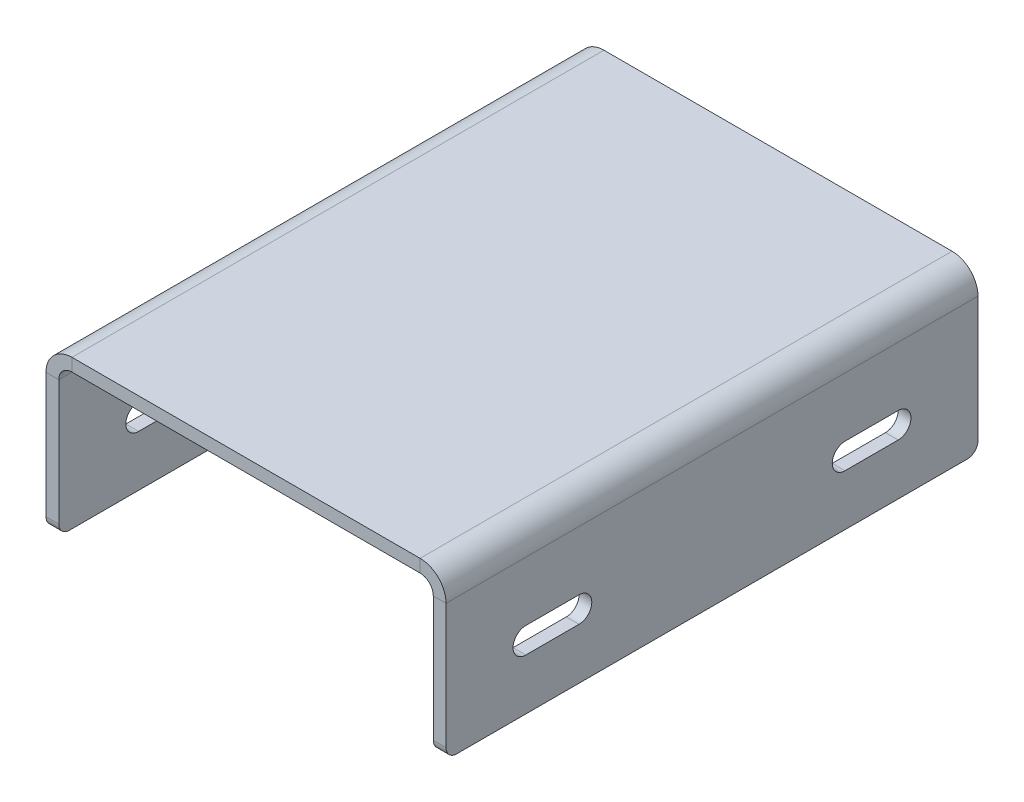
ISO-10303-21;
HEADER;
FILE_DESCRIPTION(('STEP AP214'),'2;1');
FILE_NAME('part.step','',(''),(''),'','','');
FILE_SCHEMA(('AUTOMOTIVE_DESIGN { 1 0 10303 214 1 1 1 1 }'));
ENDSEC;
DATA;
#1=APPLICATION_CONTEXT('core data for automotive mechanical design processes');
#2=APPLICATION_PROTOCOL_DEFINITION('international standard','automotive_design',2000,#1);
#3=PRODUCT_CONTEXT('',#1,'mechanical');
#4=PRODUCT('Part','Part','',(#3));
#5=PRODUCT_RELATED_PRODUCT_CATEGORY('part','',(#4));
#6=PRODUCT_DEFINITION_FORMATION('','',#4);
#7=PRODUCT_DEFINITION_CONTEXT('part definition',#1,'design');
#8=PRODUCT_DEFINITION('design','',#6,#7);
#9=PRODUCT_DEFINITION_SHAPE('','',#8);
#10=(LENGTH_UNIT() NAMED_UNIT(*) SI_UNIT(.MILLI.,.METRE.));
#11=(NAMED_UNIT(*) PLANE_ANGLE_UNIT() SI_UNIT($,.RADIAN.));
#12=(NAMED_UNIT(*) SI_UNIT($,.STERADIAN.) SOLID_ANGLE_UNIT());
#13=UNCERTAINTY_MEASURE_WITH_UNIT(LENGTH_MEASURE(1.E-05),#10,'distance_accuracy_value','');
#14=(GEOMETRIC_REPRESENTATION_CONTEXT(3) GLOBAL_UNCERTAINTY_ASSIGNED_CONTEXT((#13)) GLOBAL_UNIT_ASSIGNED_CONTEXT((#10,
#11,#12)) REPRESENTATION_CONTEXT('',''));
#15=CARTESIAN_POINT('',(0.,0.,0.));
#16=DIRECTION('',(0.,0.,1.));
#17=DIRECTION('',(1.,0.,0.));
#18=AXIS2_PLACEMENT_3D('',#15,#16,#17);
#19=CARTESIAN_POINT('',(-422.024960636595,-70.0000000000002,125.));
#20=DIRECTION('',(0.,-1.,0.));
#21=DIRECTION('',(1.,0.,0.));
#22=AXIS2_PLACEMENT_3D('',#19,#20,#21);
#23=PLANE('',#22);
#24=DIRECTION('',(0.,0.,-1.));
#25=VECTOR('',#24,1.);
#26=CARTESIAN_POINT('',(88.,-70.,125.));
#27=LINE('',#26,#25);
#28=CARTESIAN_POINT('',(88.,-70.,120.));
#29=VERTEX_POINT('',#28);
#30=CARTESIAN_POINT('',(88.,-70.,-120.));
#31=VERTEX_POINT('',#30);
#32=EDGE_CURVE('E464',#29,#31,#27,.T.);
#33=ORIENTED_EDGE('',*,*,#32,.T.);
#34=DIRECTION('',(1.,0.,0.));
#35=VECTOR('',#34,1.);
#36=CARTESIAN_POINT('',(94.0000000000001,-70.,-120.));
#37=LINE('',#36,#35);
#38=CARTESIAN_POINT('',(94.,-70.,-120.));
#39=VERTEX_POINT('',#38);
#40=EDGE_CURVE('E488',#31,#39,#37,.T.);
#41=ORIENTED_EDGE('',*,*,#40,.T.);
#42=DIRECTION('',(0.,0.,-1.));
#43=VECTOR('',#42,1.);
#44=CARTESIAN_POINT('',(94.,-70.,125.));
#45=LINE('',#44,#43);
#46=CARTESIAN_POINT('',(94.,-70.,120.));
#47=VERTEX_POINT('',#46);
#48=EDGE_CURVE('E453',#47,#39,#45,.T.);
#49=ORIENTED_EDGE('',*,*,#48,.F.);
#50=DIRECTION('',(1.,0.,0.));
#51=VECTOR('',#50,1.);
#52=CARTESIAN_POINT('',(-422.024960636595,-70.0000000000002,120.));
#53=LINE('',#52,#51);
#54=EDGE_CURVE('E486',#47,#29,#53,.F.);
#55=ORIENTED_EDGE('',*,*,#54,.T.);
#56=EDGE_LOOP('',(#33,#41,#49,#55));
#57=FACE_BOUND('',#56,.T.);
#58=ADVANCED_FACE('F42',(#57),#23,.T.);
#59=CARTESIAN_POINT('',(-422.024960636596,-2.08166817117217E-13,-125.));
#60=DIRECTION('',(0.,0.,1.));
#61=DIRECTION('',(0.,-1.,0.));
#62=AXIS2_PLACEMENT_3D('',#59,#60,#61);
#63=PLANE('',#62);
#64=DIRECTION('',(0.,1.,0.));
#65=VECTOR('',#64,1.);
#66=CARTESIAN_POINT('',(94.,5.99999999999999,-125.));
#67=LINE('',#66,#65);
#68=CARTESIAN_POINT('',(94.,-65.,-125.));
#69=VERTEX_POINT('',#68);
#70=CARTESIAN_POINT('',(94.,-6.19999999999999,-125.));
#71=VERTEX_POINT('',#70);
#72=EDGE_CURVE('E459',#69,#71,#67,.T.);
#73=ORIENTED_EDGE('',*,*,#72,.F.);
#74=DIRECTION('',(1.,0.,0.));
#75=VECTOR('',#74,1.);
#76=CARTESIAN_POINT('',(88.0000000000001,-65.,-125.));
#77=LINE('',#76,#75);
#78=CARTESIAN_POINT('',(88.,-65.,-125.));
#79=VERTEX_POINT('',#78);
#80=EDGE_CURVE('E495',#69,#79,#77,.F.);
#81=ORIENTED_EDGE('',*,*,#80,.T.);
#82=DIRECTION('',(0.,-1.,0.));
#83=VECTOR('',#82,1.);
#84=CARTESIAN_POINT('',(88.,0.,-125.));
#85=LINE('',#84,#83);
#86=CARTESIAN_POINT('',(88.,-6.2,-125.));
#87=VERTEX_POINT('',#86);
#88=EDGE_CURVE('E442',#87,#79,#85,.T.);
#89=ORIENTED_EDGE('',*,*,#88,.F.);
#90=DIRECTION('',(1.,0.,0.));
#91=VECTOR('',#90,1.);
#92=CARTESIAN_POINT('',(-422.024960636596,-6.20000000000021,-125.));
#93=LINE('',#92,#91);
#94=EDGE_CURVE('E461',#87,#71,#93,.T.);
#95=ORIENTED_EDGE('',*,*,#94,.T.);
#96=EDGE_LOOP('',(#73,#81,#89,#95));
#97=FACE_BOUND('',#96,.T.);
#98=ADVANCED_FACE('F561',(#97),#63,.F.);
#99=CARTESIAN_POINT('',(94.,5.99999999999999,125.));
#100=DIRECTION('',(-1.,0.,0.));
#101=DIRECTION('',(0.,0.,1.));
#102=AXIS2_PLACEMENT_3D('',#99,#100,#101);
#103=PLANE('',#102);
#104=DIRECTION('',(0.,0.,-1.));
#105=VECTOR('',#104,1.);
#106=CARTESIAN_POINT('',(94.,-34.,-87.5));
#107=LINE('',#106,#105);
#108=CARTESIAN_POINT('',(94.,-34.,-62.5));
#109=VERTEX_POINT('',#108);
#110=CARTESIAN_POINT('',(94.,-34.,-87.5));
#111=VERTEX_POINT('',#110);
#112=EDGE_CURVE('E276',#109,#111,#107,.T.);
#113=ORIENTED_EDGE('',*,*,#112,.T.);
#114=CARTESIAN_POINT('',(94.,-40.,-87.5));
#115=DIRECTION('',(-1.,0.,0.));
#116=DIRECTION('',(0.,0.,1.));
#117=AXIS2_PLACEMENT_3D('',#114,#115,#116);
#118=CIRCLE('',#117,6.);
#119=CARTESIAN_POINT('',(94.,-46.,-87.5));
#120=VERTEX_POINT('',#119);
#121=EDGE_CURVE('E258',#111,#120,#118,.T.);
#122=ORIENTED_EDGE('',*,*,#121,.T.);
#123=DIRECTION('',(0.,0.,1.));
#124=VECTOR('',#123,1.);
#125=CARTESIAN_POINT('',(94.,-46.,-87.5));
#126=LINE('',#125,#124);
#127=CARTESIAN_POINT('',(94.,-46.,-62.5));
#128=VERTEX_POINT('',#127);
#129=EDGE_CURVE('E268',#120,#128,#126,.T.);
#130=ORIENTED_EDGE('',*,*,#129,.T.);
#131=CARTESIAN_POINT('',(94.,-40.,-62.5));
#132=DIRECTION('',(-1.,0.,0.));
#133=DIRECTION('',(0.,0.,1.));
#134=AXIS2_PLACEMENT_3D('',#131,#132,#133);
#135=CIRCLE('',#134,6.);
#136=EDGE_CURVE('E57',#128,#109,#135,.T.);
#137=ORIENTED_EDGE('',*,*,#136,.T.);
#138=EDGE_LOOP('',(#113,#122,#130,#137));
#139=FACE_BOUND('',#138,.T.);
#140=DIRECTION('',(0.,0.,1.));
#141=VECTOR('',#140,1.);
#142=CARTESIAN_POINT('',(94.,-46.,87.5));
#143=LINE('',#142,#141);
#144=CARTESIAN_POINT('',(94.,-46.,62.5));
#145=VERTEX_POINT('',#144);
#146=CARTESIAN_POINT('',(94.,-46.,87.5));
#147=VERTEX_POINT('',#146);
#148=EDGE_CURVE('E304',#145,#147,#143,.T.);
#149=ORIENTED_EDGE('',*,*,#148,.T.);
#150=CARTESIAN_POINT('',(94.,-40.,87.5));
#151=DIRECTION('',(-1.,0.,0.));
#152=DIRECTION('',(0.,0.,-1.));
#153=AXIS2_PLACEMENT_3D('',#150,#151,#152);
#154=CIRCLE('',#153,6.);
#155=CARTESIAN_POINT('',(94.,-34.,87.5));
#156=VERTEX_POINT('',#155);
#157=EDGE_CURVE('E321',#147,#156,#154,.T.);
#158=ORIENTED_EDGE('',*,*,#157,.T.);
#159=DIRECTION('',(0.,0.,-1.));
#160=VECTOR('',#159,1.);
#161=CARTESIAN_POINT('',(94.,-34.,87.5));
#162=LINE('',#161,#160);
#163=CARTESIAN_POINT('',(94.,-34.,62.5));
#164=VERTEX_POINT('',#163);
#165=EDGE_CURVE('E331',#156,#164,#162,.T.);
#166=ORIENTED_EDGE('',*,*,#165,.T.);
#167=CARTESIAN_POINT('',(94.,-40.,62.5));
#168=DIRECTION('',(-1.,0.,0.));
#169=DIRECTION('',(0.,0.,-1.));
#170=AXIS2_PLACEMENT_3D('',#167,#168,#169);
#171=CIRCLE('',#170,6.);
#172=EDGE_CURVE('E65',#164,#145,#171,.T.);
#173=ORIENTED_EDGE('',*,*,#172,.T.);
#174=EDGE_LOOP('',(#149,#158,#166,#173));
#175=FACE_BOUND('',#174,.T.);
#176=ORIENTED_EDGE('',*,*,#48,.T.);
#177=CARTESIAN_POINT('',(94.,-65.,-120.));
#178=DIRECTION('',(-1.,0.,0.));
#179=DIRECTION('',(0.,0.,1.));
#180=AXIS2_PLACEMENT_3D('',#177,#178,#179);
#181=CIRCLE('',#180,5.);
#182=EDGE_CURVE('E493',#39,#69,#181,.F.);
#183=ORIENTED_EDGE('',*,*,#182,.T.);
#184=ORIENTED_EDGE('',*,*,#72,.T.);
#185=DIRECTION('',(0.,0.,1.));
#186=VECTOR('',#185,1.);
#187=CARTESIAN_POINT('',(94.,-6.2,-125.));
#188=LINE('',#187,#186);
#189=CARTESIAN_POINT('',(94.,-6.2,125.));
#190=VERTEX_POINT('',#189);
#191=EDGE_CURVE('E456',#71,#190,#188,.T.);
#192=ORIENTED_EDGE('',*,*,#191,.T.);
#193=DIRECTION('',(0.,1.,0.));
#194=VECTOR('',#193,1.);
#195=CARTESIAN_POINT('',(94.,5.99999999999999,125.));
#196=LINE('',#195,#194);
#197=CARTESIAN_POINT('',(94.,-65.,125.));
#198=VERTEX_POINT('',#197);
#199=EDGE_CURVE('E451',#198,#190,#196,.T.);
#200=ORIENTED_EDGE('',*,*,#199,.F.);
#201=CARTESIAN_POINT('',(94.,-65.,120.));
#202=DIRECTION('',(-1.,0.,0.));
#203=DIRECTION('',(0.,0.,1.));
#204=AXIS2_PLACEMENT_3D('',#201,#202,#203);
#205=CIRCLE('',#204,5.);
#206=EDGE_CURVE('E491',#198,#47,#205,.F.);
#207=ORIENTED_EDGE('',*,*,#206,.T.);
#208=EDGE_LOOP('',(#176,#183,#184,#192,#200,#207));
#209=FACE_BOUND('',#208,.T.);
#210=ADVANCED_FACE('F273',(#139,#175,#209),#103,.F.);
#211=CARTESIAN_POINT('',(-422.024960636596,-2.08166817117217E-13,125.));
#212=DIRECTION('',(0.,0.,1.));
#213=DIRECTION('',(0.,-1.,0.));
#214=AXIS2_PLACEMENT_3D('',#211,#212,#213);
#215=PLANE('',#214);
#216=DIRECTION('',(0.,1.,0.));
#217=VECTOR('',#216,1.);
#218=CARTESIAN_POINT('',(88.,0.,125.));
#219=LINE('',#218,#217);
#220=CARTESIAN_POINT('',(88.,-65.,125.));
#221=VERTEX_POINT('',#220);
#222=CARTESIAN_POINT('',(88.,-6.19999999999996,125.));
#223=VERTEX_POINT('',#222);
#224=EDGE_CURVE('E449',#221,#223,#219,.T.);
#225=ORIENTED_EDGE('',*,*,#224,.F.);
#226=DIRECTION('',(1.,0.,0.));
#227=VECTOR('',#226,1.);
#228=CARTESIAN_POINT('',(-422.024960636596,-65.0000000000002,125.));
#229=LINE('',#228,#227);
#230=EDGE_CURVE('E501',#221,#198,#229,.T.);
#231=ORIENTED_EDGE('',*,*,#230,.T.);
#232=ORIENTED_EDGE('',*,*,#199,.T.);
#233=DIRECTION('',(1.,0.,0.));
#234=VECTOR('',#233,1.);
#235=CARTESIAN_POINT('',(-422.024960636596,-6.20000000000021,125.));
#236=LINE('',#235,#234);
#237=EDGE_CURVE('E418',#223,#190,#236,.T.);
#238=ORIENTED_EDGE('',*,*,#237,.F.);
#239=EDGE_LOOP('',(#225,#231,#232,#238));
#240=FACE_BOUND('',#239,.T.);
#241=ADVANCED_FACE('F575',(#240),#215,.T.);
#242=CARTESIAN_POINT('',(88.,0.,125.));
#243=DIRECTION('',(1.,0.,0.));
#244=DIRECTION('',(0.,1.,0.));
#245=AXIS2_PLACEMENT_3D('',#242,#243,#244);
#246=PLANE('',#245);
#247=DIRECTION('',(0.,0.,-1.));
#248=VECTOR('',#247,1.);
#249=CARTESIAN_POINT('',(88.,-45.9999999999999,125.));
#250=LINE('',#249,#248);
#251=CARTESIAN_POINT('',(88.,-46.,-62.5));
#252=VERTEX_POINT('',#251);
#253=CARTESIAN_POINT('',(88.,-46.,-87.5));
#254=VERTEX_POINT('',#253);
#255=EDGE_CURVE('E347',#252,#254,#250,.T.);
#256=ORIENTED_EDGE('',*,*,#255,.T.);
#257=CARTESIAN_POINT('',(88.,-40.,-87.5));
#258=DIRECTION('',(1.,0.,0.));
#259=DIRECTION('',(0.,1.,0.));
#260=AXIS2_PLACEMENT_3D('',#257,#258,#259);
#261=CIRCLE('',#260,6.);
#262=CARTESIAN_POINT('',(88.,-34.,-87.5));
#263=VERTEX_POINT('',#262);
#264=EDGE_CURVE('E261',#254,#263,#261,.T.);
#265=ORIENTED_EDGE('',*,*,#264,.T.);
#266=DIRECTION('',(0.,0.,1.));
#267=VECTOR('',#266,1.);
#268=CARTESIAN_POINT('',(88.,-33.9999999999999,125.));
#269=LINE('',#268,#267);
#270=CARTESIAN_POINT('',(88.,-34.,-62.5));
#271=VERTEX_POINT('',#270);
#272=EDGE_CURVE('E352',#263,#271,#269,.T.);
#273=ORIENTED_EDGE('',*,*,#272,.T.);
#274=CARTESIAN_POINT('',(88.,-40.,-62.5));
#275=DIRECTION('',(1.,0.,0.));
#276=DIRECTION('',(0.,1.,0.));
#277=AXIS2_PLACEMENT_3D('',#274,#275,#276);
#278=CIRCLE('',#277,6.);
#279=EDGE_CURVE('E349',#271,#252,#278,.T.);
#280=ORIENTED_EDGE('',*,*,#279,.T.);
#281=EDGE_LOOP('',(#256,#265,#273,#280));
#282=FACE_BOUND('',#281,.T.);
#283=DIRECTION('',(0.,0.,1.));
#284=VECTOR('',#283,1.);
#285=CARTESIAN_POINT('',(88.,-34.,125.));
#286=LINE('',#285,#284);
#287=CARTESIAN_POINT('',(88.,-34.,62.5));
#288=VERTEX_POINT('',#287);
#289=CARTESIAN_POINT('',(88.,-34.,87.5));
#290=VERTEX_POINT('',#289);
#291=EDGE_CURVE('E295',#288,#290,#286,.T.);
#292=ORIENTED_EDGE('',*,*,#291,.T.);
#293=CARTESIAN_POINT('',(88.,-40.,87.5));
#294=DIRECTION('',(1.,0.,0.));
#295=DIRECTION('',(0.,1.,0.));
#296=AXIS2_PLACEMENT_3D('',#293,#294,#295);
#297=CIRCLE('',#296,6.);
#298=CARTESIAN_POINT('',(88.,-46.,87.5));
#299=VERTEX_POINT('',#298);
#300=EDGE_CURVE('E344',#290,#299,#297,.T.);
#301=ORIENTED_EDGE('',*,*,#300,.T.);
#302=DIRECTION('',(0.,0.,-1.));
#303=VECTOR('',#302,1.);
#304=CARTESIAN_POINT('',(88.,-46.,125.));
#305=LINE('',#304,#303);
#306=CARTESIAN_POINT('',(88.,-46.,62.5));
#307=VERTEX_POINT('',#306);
#308=EDGE_CURVE('E341',#299,#307,#305,.T.);
#309=ORIENTED_EDGE('',*,*,#308,.T.);
#310=CARTESIAN_POINT('',(88.,-40.,62.5));
#311=DIRECTION('',(1.,0.,0.));
#312=DIRECTION('',(0.,1.,0.));
#313=AXIS2_PLACEMENT_3D('',#310,#311,#312);
#314=CIRCLE('',#313,6.);
#315=EDGE_CURVE('E338',#307,#288,#314,.T.);
#316=ORIENTED_EDGE('',*,*,#315,.T.);
#317=EDGE_LOOP('',(#292,#301,#309,#316));
#318=FACE_BOUND('',#317,.T.);
#319=ORIENTED_EDGE('',*,*,#88,.T.);
#320=CARTESIAN_POINT('',(88.,-65.,-120.));
#321=DIRECTION('',(1.,0.,0.));
#322=DIRECTION('',(0.,1.,0.));
#323=AXIS2_PLACEMENT_3D('',#320,#321,#322);
#324=CIRCLE('',#323,5.);
#325=EDGE_CURVE('E499',#79,#31,#324,.F.);
#326=ORIENTED_EDGE('',*,*,#325,.T.);
#327=ORIENTED_EDGE('',*,*,#32,.F.);
#328=CARTESIAN_POINT('',(88.,-65.,120.));
#329=DIRECTION('',(1.,0.,0.));
#330=DIRECTION('',(0.,1.,0.));
#331=AXIS2_PLACEMENT_3D('',#328,#329,#330);
#332=CIRCLE('',#331,5.);
#333=EDGE_CURVE('E497',#29,#221,#332,.F.);
#334=ORIENTED_EDGE('',*,*,#333,.T.);
#335=ORIENTED_EDGE('',*,*,#224,.T.);
#336=DIRECTION('',(0.,0.,-1.));
#337=VECTOR('',#336,1.);
#338=CARTESIAN_POINT('',(88.,-6.2,-125.));
#339=LINE('',#338,#337);
#340=EDGE_CURVE('E446',#223,#87,#339,.T.);
#341=ORIENTED_EDGE('',*,*,#340,.T.);
#342=EDGE_LOOP('',(#319,#326,#327,#334,#335,#341));
#343=FACE_BOUND('',#342,.T.);
#344=ADVANCED_FACE('F578',(#282,#318,#343),#246,.F.);
#345=CARTESIAN_POINT('',(422.024960636595,-70.,125.));
#346=DIRECTION('',(0.,1.,0.));
#347=DIRECTION('',(-1.,0.,0.));
#348=AXIS2_PLACEMENT_3D('',#345,#346,#347);
#349=PLANE('',#348);
#350=DIRECTION('',(0.,0.,-1.));
#351=VECTOR('',#350,1.);
#352=CARTESIAN_POINT('',(-88.,-70.,125.));
#353=LINE('',#352,#351);
#354=CARTESIAN_POINT('',(-88.,-70.,120.));
#355=VERTEX_POINT('',#354);
#356=CARTESIAN_POINT('',(-88.,-70.,-120.));
#357=VERTEX_POINT('',#356);
#358=EDGE_CURVE('E415',#355,#357,#353,.T.);
#359=ORIENTED_EDGE('',*,*,#358,.F.);
#360=DIRECTION('',(-1.,0.,0.));
#361=VECTOR('',#360,1.);
#362=CARTESIAN_POINT('',(-94.,-70.,120.));
#363=LINE('',#362,#361);
#364=CARTESIAN_POINT('',(-94.,-70.,120.));
#365=VERTEX_POINT('',#364);
#366=EDGE_CURVE('E470',#355,#365,#363,.T.);
#367=ORIENTED_EDGE('',*,*,#366,.T.);
#368=DIRECTION('',(0.,0.,-1.));
#369=VECTOR('',#368,1.);
#370=CARTESIAN_POINT('',(-94.,-70.,125.));
#371=LINE('',#370,#369);
#372=CARTESIAN_POINT('',(-94.,-70.,-120.));
#373=VERTEX_POINT('',#372);
#374=EDGE_CURVE('E437',#365,#373,#371,.T.);
#375=ORIENTED_EDGE('',*,*,#374,.T.);
#376=DIRECTION('',(-1.,0.,0.));
#377=VECTOR('',#376,1.);
#378=CARTESIAN_POINT('',(422.024960636595,-70.,-120.));
#379=LINE('',#378,#377);
#380=EDGE_CURVE('E445',#373,#357,#379,.F.);
#381=ORIENTED_EDGE('',*,*,#380,.T.);
#382=EDGE_LOOP('',(#359,#367,#375,#381));
#383=FACE_BOUND('',#382,.T.);
#384=ADVANCED_FACE('F582',(#383),#349,.F.);
#385=CARTESIAN_POINT('',(422.024960636595,-70.,125.));
#386=DIRECTION('',(0.,0.,1.));
#387=DIRECTION('',(0.,1.,0.));
#388=AXIS2_PLACEMENT_3D('',#385,#386,#387);
#389=PLANE('',#388);
#390=DIRECTION('',(0.,-1.,0.));
#391=VECTOR('',#390,1.);
#392=CARTESIAN_POINT('',(-94.,-70.,125.));
#393=LINE('',#392,#391);
#394=CARTESIAN_POINT('',(-94.,-6.19999999999994,125.));
#395=VERTEX_POINT('',#394);
#396=CARTESIAN_POINT('',(-94.,-65.,125.));
#397=VERTEX_POINT('',#396);
#398=EDGE_CURVE('E434',#395,#397,#393,.T.);
#399=ORIENTED_EDGE('',*,*,#398,.T.);
#400=DIRECTION('',(-1.,0.,0.));
#401=VECTOR('',#400,1.);
#402=CARTESIAN_POINT('',(-88.,-65.,125.));
#403=LINE('',#402,#401);
#404=CARTESIAN_POINT('',(-88.,-65.,125.));
#405=VERTEX_POINT('',#404);
#406=EDGE_CURVE('E477',#397,#405,#403,.F.);
#407=ORIENTED_EDGE('',*,*,#406,.T.);
#408=DIRECTION('',(0.,1.,0.));
#409=VECTOR('',#408,1.);
#410=CARTESIAN_POINT('',(-88.,-70.,125.));
#411=LINE('',#410,#409);
#412=CARTESIAN_POINT('',(-88.,-6.19999999999997,125.));
#413=VERTEX_POINT('',#412);
#414=EDGE_CURVE('E432',#405,#413,#411,.T.);
#415=ORIENTED_EDGE('',*,*,#414,.T.);
#416=DIRECTION('',(-1.,0.,0.));
#417=VECTOR('',#416,1.);
#418=CARTESIAN_POINT('',(422.024960636595,-6.19999999999998,125.));
#419=LINE('',#418,#417);
#420=EDGE_CURVE('E429',#413,#395,#419,.T.);
#421=ORIENTED_EDGE('',*,*,#420,.T.);
#422=EDGE_LOOP('',(#399,#407,#415,#421));
#423=FACE_BOUND('',#422,.T.);
#424=ADVANCED_FACE('F673',(#423),#389,.T.);
#425=CARTESIAN_POINT('',(-94.,-70.,125.));
#426=DIRECTION('',(1.,0.,0.));
#427=DIRECTION('',(0.,0.,-1.));
#428=AXIS2_PLACEMENT_3D('',#425,#426,#427);
#429=PLANE('',#428);
#430=DIRECTION('',(0.,0.,1.));
#431=VECTOR('',#430,1.);
#432=CARTESIAN_POINT('',(-94.,-46.,-87.5));
#433=LINE('',#432,#431);
#434=CARTESIAN_POINT('',(-94.,-46.,-87.5));
#435=VERTEX_POINT('',#434);
#436=CARTESIAN_POINT('',(-94.,-46.,-62.5));
#437=VERTEX_POINT('',#436);
#438=EDGE_CURVE('E287',#435,#437,#433,.T.);
#439=ORIENTED_EDGE('',*,*,#438,.F.);
#440=CARTESIAN_POINT('',(-94.,-40.,-87.5));
#441=DIRECTION('',(-1.,0.,0.));
#442=DIRECTION('',(0.,0.,1.));
#443=AXIS2_PLACEMENT_3D('',#440,#441,#442);
#444=CIRCLE('',#443,6.);
#445=CARTESIAN_POINT('',(-94.,-34.,-87.5));
#446=VERTEX_POINT('',#445);
#447=EDGE_CURVE('E285',#446,#435,#444,.T.);
#448=ORIENTED_EDGE('',*,*,#447,.F.);
#449=DIRECTION('',(0.,0.,-1.));
#450=VECTOR('',#449,1.);
#451=CARTESIAN_POINT('',(-94.,-34.,-87.5));
#452=LINE('',#451,#450);
#453=CARTESIAN_POINT('',(-94.,-34.,-62.5));
#454=VERTEX_POINT('',#453);
#455=EDGE_CURVE('E277',#454,#446,#452,.T.);
#456=ORIENTED_EDGE('',*,*,#455,.F.);
#457=CARTESIAN_POINT('',(-94.,-40.,-62.5));
#458=DIRECTION('',(-1.,0.,0.));
#459=DIRECTION('',(0.,0.,1.));
#460=AXIS2_PLACEMENT_3D('',#457,#458,#459);
#461=CIRCLE('',#460,6.);
#462=EDGE_CURVE('E280',#437,#454,#461,.T.);
#463=ORIENTED_EDGE('',*,*,#462,.F.);
#464=EDGE_LOOP('',(#439,#448,#456,#463));
#465=FACE_BOUND('',#464,.T.);
#466=DIRECTION('',(0.,0.,-1.));
#467=VECTOR('',#466,1.);
#468=CARTESIAN_POINT('',(-94.,-34.,87.5));
#469=LINE('',#468,#467);
#470=CARTESIAN_POINT('',(-94.,-34.,87.5));
#471=VERTEX_POINT('',#470);
#472=CARTESIAN_POINT('',(-94.,-34.,62.5));
#473=VERTEX_POINT('',#472);
#474=EDGE_CURVE('E324',#471,#473,#469,.T.);
#475=ORIENTED_EDGE('',*,*,#474,.F.);
#476=CARTESIAN_POINT('',(-94.,-40.,87.5));
#477=DIRECTION('',(-1.,0.,0.));
#478=DIRECTION('',(0.,0.,-1.));
#479=AXIS2_PLACEMENT_3D('',#476,#477,#478);
#480=CIRCLE('',#479,6.);
#481=CARTESIAN_POINT('',(-94.,-46.,87.5));
#482=VERTEX_POINT('',#481);
#483=EDGE_CURVE('E288',#482,#471,#480,.T.);
#484=ORIENTED_EDGE('',*,*,#483,.F.);
#485=DIRECTION('',(0.,0.,1.));
#486=VECTOR('',#485,1.);
#487=CARTESIAN_POINT('',(-94.,-46.,87.5));
#488=LINE('',#487,#486);
#489=CARTESIAN_POINT('',(-94.,-46.,62.5));
#490=VERTEX_POINT('',#489);
#491=EDGE_CURVE('E317',#490,#482,#488,.T.);
#492=ORIENTED_EDGE('',*,*,#491,.F.);
#493=CARTESIAN_POINT('',(-94.,-40.,62.5));
#494=DIRECTION('',(-1.,0.,0.));
#495=DIRECTION('',(0.,0.,-1.));
#496=AXIS2_PLACEMENT_3D('',#493,#494,#495);
#497=CIRCLE('',#496,6.);
#498=EDGE_CURVE('E320',#473,#490,#497,.T.);
#499=ORIENTED_EDGE('',*,*,#498,.F.);
#500=EDGE_LOOP('',(#475,#484,#492,#499));
#501=FACE_BOUND('',#500,.T.);
#502=ORIENTED_EDGE('',*,*,#374,.F.);
#503=CARTESIAN_POINT('',(-94.,-65.,120.));
#504=DIRECTION('',(1.,0.,0.));
#505=DIRECTION('',(0.,0.,-1.));
#506=AXIS2_PLACEMENT_3D('',#503,#504,#505);
#507=CIRCLE('',#506,5.);
#508=EDGE_CURVE('E475',#365,#397,#507,.F.);
#509=ORIENTED_EDGE('',*,*,#508,.T.);
#510=ORIENTED_EDGE('',*,*,#398,.F.);
#511=DIRECTION('',(0.,0.,-1.));
#512=VECTOR('',#511,1.);
#513=CARTESIAN_POINT('',(-94.,-6.19999999999998,125.));
#514=LINE('',#513,#512);
#515=CARTESIAN_POINT('',(-94.,-6.2,-125.));
#516=VERTEX_POINT('',#515);
#517=EDGE_CURVE('E426',#395,#516,#514,.T.);
#518=ORIENTED_EDGE('',*,*,#517,.T.);
#519=DIRECTION('',(0.,1.,0.));
#520=VECTOR('',#519,1.);
#521=CARTESIAN_POINT('',(-94.,-70.,-125.));
#522=LINE('',#521,#520);
#523=CARTESIAN_POINT('',(-94.,-65.,-125.));
#524=VERTEX_POINT('',#523);
#525=EDGE_CURVE('E424',#524,#516,#522,.T.);
#526=ORIENTED_EDGE('',*,*,#525,.F.);
#527=CARTESIAN_POINT('',(-94.,-65.,-120.));
#528=DIRECTION('',(1.,0.,0.));
#529=DIRECTION('',(0.,0.,-1.));
#530=AXIS2_PLACEMENT_3D('',#527,#528,#529);
#531=CIRCLE('',#530,5.);
#532=EDGE_CURVE('E473',#524,#373,#531,.F.);
#533=ORIENTED_EDGE('',*,*,#532,.T.);
#534=EDGE_LOOP('',(#502,#509,#510,#518,#526,#533));
#535=FACE_BOUND('',#534,.T.);
#536=ADVANCED_FACE('F537',(#465,#501,#535),#429,.F.);
#537=CARTESIAN_POINT('',(422.024960636595,-70.,-125.));
#538=DIRECTION('',(0.,0.,1.));
#539=DIRECTION('',(0.,1.,0.));
#540=AXIS2_PLACEMENT_3D('',#537,#538,#539);
#541=PLANE('',#540);
#542=DIRECTION('',(0.,1.,0.));
#543=VECTOR('',#542,1.);
#544=CARTESIAN_POINT('',(-88.,-70.,-125.));
#545=LINE('',#544,#543);
#546=CARTESIAN_POINT('',(-88.,-65.,-125.));
#547=VERTEX_POINT('',#546);
#548=CARTESIAN_POINT('',(-88.,-6.19999999999997,-125.));
#549=VERTEX_POINT('',#548);
#550=EDGE_CURVE('E422',#547,#549,#545,.T.);
#551=ORIENTED_EDGE('',*,*,#550,.F.);
#552=DIRECTION('',(-1.,0.,0.));
#553=VECTOR('',#552,1.);
#554=CARTESIAN_POINT('',(422.024960636595,-65.,-125.));
#555=LINE('',#554,#553);
#556=EDGE_CURVE('E483',#547,#524,#555,.T.);
#557=ORIENTED_EDGE('',*,*,#556,.T.);
#558=ORIENTED_EDGE('',*,*,#525,.T.);
#559=DIRECTION('',(-1.,0.,0.));
#560=VECTOR('',#559,1.);
#561=CARTESIAN_POINT('',(422.024960636595,-6.19999999999998,-125.));
#562=LINE('',#561,#560);
#563=EDGE_CURVE('E414',#549,#516,#562,.T.);
#564=ORIENTED_EDGE('',*,*,#563,.F.);
#565=EDGE_LOOP('',(#551,#557,#558,#564));
#566=FACE_BOUND('',#565,.T.);
#567=ADVANCED_FACE('F679',(#566),#541,.F.);
#568=CARTESIAN_POINT('',(-88.,-70.,125.));
#569=DIRECTION('',(-1.,0.,0.));
#570=DIRECTION('',(0.,0.,1.));
#571=AXIS2_PLACEMENT_3D('',#568,#569,#570);
#572=PLANE('',#571);
#573=DIRECTION('',(0.,0.,-1.));
#574=VECTOR('',#573,1.);
#575=CARTESIAN_POINT('',(-88.,-33.9999999999999,125.));
#576=LINE('',#575,#574);
#577=CARTESIAN_POINT('',(-88.,-34.,-62.5));
#578=VERTEX_POINT('',#577);
#579=CARTESIAN_POINT('',(-88.,-34.,-87.5));
#580=VERTEX_POINT('',#579);
#581=EDGE_CURVE('E50',#578,#580,#576,.T.);
#582=ORIENTED_EDGE('',*,*,#581,.T.);
#583=CARTESIAN_POINT('',(-88.,-40.,-87.5));
#584=DIRECTION('',(-1.,0.,0.));
#585=DIRECTION('',(0.,0.,1.));
#586=AXIS2_PLACEMENT_3D('',#583,#584,#585);
#587=CIRCLE('',#586,6.);
#588=CARTESIAN_POINT('',(-88.,-46.,-87.5));
#589=VERTEX_POINT('',#588);
#590=EDGE_CURVE('E11',#580,#589,#587,.T.);
#591=ORIENTED_EDGE('',*,*,#590,.T.);
#592=DIRECTION('',(0.,0.,1.));
#593=VECTOR('',#592,1.);
#594=CARTESIAN_POINT('',(-88.,-45.9999999999999,125.));
#595=LINE('',#594,#593);
#596=CARTESIAN_POINT('',(-88.,-46.,-62.5));
#597=VERTEX_POINT('',#596);
#598=EDGE_CURVE('E516',#589,#597,#595,.T.);
#599=ORIENTED_EDGE('',*,*,#598,.T.);
#600=CARTESIAN_POINT('',(-88.,-40.,-62.5));
#601=DIRECTION('',(-1.,0.,0.));
#602=DIRECTION('',(0.,0.,1.));
#603=AXIS2_PLACEMENT_3D('',#600,#601,#602);
#604=CIRCLE('',#603,6.);
#605=EDGE_CURVE('E519',#597,#578,#604,.T.);
#606=ORIENTED_EDGE('',*,*,#605,.T.);
#607=EDGE_LOOP('',(#582,#591,#599,#606));
#608=FACE_BOUND('',#607,.T.);
#609=DIRECTION('',(0.,0.,1.));
#610=VECTOR('',#609,1.);
#611=CARTESIAN_POINT('',(-88.,-46.,125.));
#612=LINE('',#611,#610);
#613=CARTESIAN_POINT('',(-88.,-46.,62.5));
#614=VERTEX_POINT('',#613);
#615=CARTESIAN_POINT('',(-88.,-46.,87.5));
#616=VERTEX_POINT('',#615);
#617=EDGE_CURVE('E510',#614,#616,#612,.T.);
#618=ORIENTED_EDGE('',*,*,#617,.T.);
#619=CARTESIAN_POINT('',(-88.,-40.,87.5));
#620=DIRECTION('',(-1.,0.,0.));
#621=DIRECTION('',(0.,0.,1.));
#622=AXIS2_PLACEMENT_3D('',#619,#620,#621);
#623=CIRCLE('',#622,6.);
#624=CARTESIAN_POINT('',(-88.,-34.,87.5));
#625=VERTEX_POINT('',#624);
#626=EDGE_CURVE('E513',#616,#625,#623,.T.);
#627=ORIENTED_EDGE('',*,*,#626,.T.);
#628=DIRECTION('',(0.,0.,-1.));
#629=VECTOR('',#628,1.);
#630=CARTESIAN_POINT('',(-88.,-34.,125.));
#631=LINE('',#630,#629);
#632=CARTESIAN_POINT('',(-88.,-34.,62.5));
#633=VERTEX_POINT('',#632);
#634=EDGE_CURVE('E504',#625,#633,#631,.T.);
#635=ORIENTED_EDGE('',*,*,#634,.T.);
#636=CARTESIAN_POINT('',(-88.,-40.,62.5));
#637=DIRECTION('',(-1.,0.,0.));
#638=DIRECTION('',(0.,0.,1.));
#639=AXIS2_PLACEMENT_3D('',#636,#637,#638);
#640=CIRCLE('',#639,6.);
#641=EDGE_CURVE('E507',#633,#614,#640,.T.);
#642=ORIENTED_EDGE('',*,*,#641,.T.);
#643=EDGE_LOOP('',(#618,#627,#635,#642));
#644=FACE_BOUND('',#643,.T.);
#645=ORIENTED_EDGE('',*,*,#414,.F.);
#646=CARTESIAN_POINT('',(-88.,-65.,120.));
#647=DIRECTION('',(-1.,0.,0.));
#648=DIRECTION('',(0.,0.,1.));
#649=AXIS2_PLACEMENT_3D('',#646,#647,#648);
#650=CIRCLE('',#649,5.);
#651=EDGE_CURVE('E481',#405,#355,#650,.F.);
#652=ORIENTED_EDGE('',*,*,#651,.T.);
#653=ORIENTED_EDGE('',*,*,#358,.T.);
#654=CARTESIAN_POINT('',(-88.,-65.,-120.));
#655=DIRECTION('',(-1.,0.,0.));
#656=DIRECTION('',(0.,0.,1.));
#657=AXIS2_PLACEMENT_3D('',#654,#655,#656);
#658=CIRCLE('',#657,5.);
#659=EDGE_CURVE('E479',#357,#547,#658,.F.);
#660=ORIENTED_EDGE('',*,*,#659,.T.);
#661=ORIENTED_EDGE('',*,*,#550,.T.);
#662=DIRECTION('',(0.,0.,1.));
#663=VECTOR('',#662,1.);
#664=CARTESIAN_POINT('',(-88.,-6.19999999999998,125.));
#665=LINE('',#664,#663);
#666=EDGE_CURVE('E419',#549,#413,#665,.T.);
#667=ORIENTED_EDGE('',*,*,#666,.T.);
#668=EDGE_LOOP('',(#645,#652,#653,#660,#661,#667));
#669=FACE_BOUND('',#668,.T.);
#670=ADVANCED_FACE('F523',(#608,#644,#669),#572,.F.);
#671=CARTESIAN_POINT('',(-88.,-591.54484350549,-125.));
#672=DIRECTION('',(0.,0.,1.));
#673=DIRECTION('',(1.,0.,0.));
#674=AXIS2_PLACEMENT_3D('',#671,#672,#673);
#675=PLANE('',#674);
#676=DIRECTION('',(0.,1.,0.));
#677=VECTOR('',#676,1.);
#678=CARTESIAN_POINT('',(-81.8,-591.54484350549,-125.));
#679=LINE('',#678,#677);
#680=CARTESIAN_POINT('',(-81.8,0.,-125.));
#681=VERTEX_POINT('',#680);
#682=CARTESIAN_POINT('',(-81.8,6.00000000000001,-125.));
#683=VERTEX_POINT('',#682);
#684=EDGE_CURVE('E396',#681,#683,#679,.T.);
#685=ORIENTED_EDGE('',*,*,#684,.T.);
#686=DIRECTION('',(-1.,0.,0.));
#687=VECTOR('',#686,1.);
#688=CARTESIAN_POINT('',(-94.,6.,-125.));
#689=LINE('',#688,#687);
#690=CARTESIAN_POINT('',(81.8,6.,-125.));
#691=VERTEX_POINT('',#690);
#692=EDGE_CURVE('E376',#691,#683,#689,.T.);
#693=ORIENTED_EDGE('',*,*,#692,.F.);
#694=DIRECTION('',(0.,1.,0.));
#695=VECTOR('',#694,1.);
#696=CARTESIAN_POINT('',(81.8,-591.54484350549,-125.));
#697=LINE('',#696,#695);
#698=CARTESIAN_POINT('',(81.8,0.,-125.));
#699=VERTEX_POINT('',#698);
#700=EDGE_CURVE('E405',#699,#691,#697,.T.);
#701=ORIENTED_EDGE('',*,*,#700,.F.);
#702=DIRECTION('',(1.,0.,0.));
#703=VECTOR('',#702,1.);
#704=CARTESIAN_POINT('',(-88.,0.,-125.));
#705=LINE('',#704,#703);
#706=EDGE_CURVE('E388',#681,#699,#705,.T.);
#707=ORIENTED_EDGE('',*,*,#706,.F.);
#708=EDGE_LOOP('',(#685,#693,#701,#707));
#709=FACE_BOUND('',#708,.T.);
#710=ADVANCED_FACE('F647',(#709),#675,.F.);
#711=CARTESIAN_POINT('',(-88.,-591.54484350549,125.));
#712=DIRECTION('',(0.,0.,1.));
#713=DIRECTION('',(1.,0.,0.));
#714=AXIS2_PLACEMENT_3D('',#711,#712,#713);
#715=PLANE('',#714);
#716=DIRECTION('',(-1.,0.,0.));
#717=VECTOR('',#716,1.);
#718=CARTESIAN_POINT('',(-94.,6.,125.));
#719=LINE('',#718,#717);
#720=CARTESIAN_POINT('',(81.8,6.,125.));
#721=VERTEX_POINT('',#720);
#722=CARTESIAN_POINT('',(-81.8,6.,125.));
#723=VERTEX_POINT('',#722);
#724=EDGE_CURVE('E382',#721,#723,#719,.T.);
#725=ORIENTED_EDGE('',*,*,#724,.T.);
#726=DIRECTION('',(0.,1.,0.));
#727=VECTOR('',#726,1.);
#728=CARTESIAN_POINT('',(-81.8,-591.54484350549,125.));
#729=LINE('',#728,#727);
#730=CARTESIAN_POINT('',(-81.8,0.,125.));
#731=VERTEX_POINT('',#730);
#732=EDGE_CURVE('E399',#731,#723,#729,.T.);
#733=ORIENTED_EDGE('',*,*,#732,.F.);
#734=DIRECTION('',(1.,0.,0.));
#735=VECTOR('',#734,1.);
#736=CARTESIAN_POINT('',(-88.,0.,125.));
#737=LINE('',#736,#735);
#738=CARTESIAN_POINT('',(81.8,0.,125.));
#739=VERTEX_POINT('',#738);
#740=EDGE_CURVE('E390',#731,#739,#737,.T.);
#741=ORIENTED_EDGE('',*,*,#740,.T.);
#742=DIRECTION('',(0.,1.,0.));
#743=VECTOR('',#742,1.);
#744=CARTESIAN_POINT('',(81.8,-591.54484350549,125.));
#745=LINE('',#744,#743);
#746=EDGE_CURVE('E402',#739,#721,#745,.T.);
#747=ORIENTED_EDGE('',*,*,#746,.T.);
#748=EDGE_LOOP('',(#725,#733,#741,#747));
#749=FACE_BOUND('',#748,.T.);
#750=ADVANCED_FACE('F635',(#749),#715,.T.);
#751=CARTESIAN_POINT('',(-88.,0.,125.));
#752=DIRECTION('',(0.,1.,0.));
#753=DIRECTION('',(0.,0.,1.));
#754=AXIS2_PLACEMENT_3D('',#751,#752,#753);
#755=PLANE('',#754);
#756=DIRECTION('',(0.,0.,-1.));
#757=VECTOR('',#756,1.);
#758=CARTESIAN_POINT('',(81.8,0.,-125.));
#759=LINE('',#758,#757);
#760=EDGE_CURVE('E393',#739,#699,#759,.T.);
#761=ORIENTED_EDGE('',*,*,#760,.F.);
#762=ORIENTED_EDGE('',*,*,#740,.F.);
#763=DIRECTION('',(0.,0.,1.));
#764=VECTOR('',#763,1.);
#765=CARTESIAN_POINT('',(-81.8,0.,125.));
#766=LINE('',#765,#764);
#767=EDGE_CURVE('E408',#681,#731,#766,.T.);
#768=ORIENTED_EDGE('',*,*,#767,.F.);
#769=ORIENTED_EDGE('',*,*,#706,.T.);
#770=EDGE_LOOP('',(#761,#762,#768,#769));
#771=FACE_BOUND('',#770,.T.);
#772=ADVANCED_FACE('F631',(#771),#755,.F.);
#773=CARTESIAN_POINT('',(-94.,6.,125.));
#774=DIRECTION('',(0.,-1.,0.));
#775=DIRECTION('',(0.,0.,-1.));
#776=AXIS2_PLACEMENT_3D('',#773,#774,#775);
#777=PLANE('',#776);
#778=DIRECTION('',(0.,0.,1.));
#779=VECTOR('',#778,1.);
#780=CARTESIAN_POINT('',(81.8,6.00000000000001,-125.));
#781=LINE('',#780,#779);
#782=EDGE_CURVE('E385',#691,#721,#781,.T.);
#783=ORIENTED_EDGE('',*,*,#782,.F.);
#784=ORIENTED_EDGE('',*,*,#692,.T.);
#785=DIRECTION('',(0.,0.,-1.));
#786=VECTOR('',#785,1.);
#787=CARTESIAN_POINT('',(-81.8,6.00000000000001,125.));
#788=LINE('',#787,#786);
#789=EDGE_CURVE('E411',#723,#683,#788,.T.);
#790=ORIENTED_EDGE('',*,*,#789,.F.);
#791=ORIENTED_EDGE('',*,*,#724,.F.);
#792=EDGE_LOOP('',(#783,#784,#790,#791));
#793=FACE_BOUND('',#792,.T.);
#794=ADVANCED_FACE('F656',(#793),#777,.F.);
#795=CARTESIAN_POINT('',(-81.8,-6.2,125.));
#796=DIRECTION('',(0.,0.,1.));
#797=DIRECTION('',(1.,0.,0.));
#798=AXIS2_PLACEMENT_3D('',#795,#796,#797);
#799=PLANE('',#798);
#800=ORIENTED_EDGE('',*,*,#420,.F.);
#801=CARTESIAN_POINT('',(-81.8,-6.2,125.));
#802=DIRECTION('',(0.,0.,-1.));
#803=DIRECTION('',(-1.,0.,0.));
#804=AXIS2_PLACEMENT_3D('',#801,#802,#803);
#805=CIRCLE('',#804,6.2);
#806=EDGE_CURVE('E364',#413,#731,#805,.T.);
#807=ORIENTED_EDGE('',*,*,#806,.T.);
#808=ORIENTED_EDGE('',*,*,#732,.T.);
#809=CARTESIAN_POINT('',(-81.8,-6.2,125.));
#810=DIRECTION('',(0.,0.,-1.));
#811=DIRECTION('',(-1.,0.,0.));
#812=AXIS2_PLACEMENT_3D('',#809,#810,#811);
#813=CIRCLE('',#812,12.2);
#814=EDGE_CURVE('E369',#395,#723,#813,.T.);
#815=ORIENTED_EDGE('',*,*,#814,.F.);
#816=EDGE_LOOP('',(#800,#807,#808,#815));
#817=FACE_BOUND('',#816,.T.);
#818=ADVANCED_FACE('F640',(#817),#799,.T.);
#819=CARTESIAN_POINT('',(-81.8,-6.2,-125.));
#820=DIRECTION('',(0.,0.,-1.));
#821=DIRECTION('',(-1.,0.,0.));
#822=AXIS2_PLACEMENT_3D('',#819,#820,#821);
#823=PLANE('',#822);
#824=CARTESIAN_POINT('',(-81.8,-6.2,-125.));
#825=DIRECTION('',(0.,0.,-1.));
#826=DIRECTION('',(-1.,0.,0.));
#827=AXIS2_PLACEMENT_3D('',#824,#825,#826);
#828=CIRCLE('',#827,6.2);
#829=EDGE_CURVE('E373',#681,#549,#828,.F.);
#830=ORIENTED_EDGE('',*,*,#829,.T.);
#831=ORIENTED_EDGE('',*,*,#563,.T.);
#832=CARTESIAN_POINT('',(-81.8,-6.2,-125.));
#833=DIRECTION('',(0.,0.,-1.));
#834=DIRECTION('',(-1.,0.,0.));
#835=AXIS2_PLACEMENT_3D('',#832,#833,#834);
#836=CIRCLE('',#835,12.2);
#837=EDGE_CURVE('E372',#683,#516,#836,.F.);
#838=ORIENTED_EDGE('',*,*,#837,.F.);
#839=ORIENTED_EDGE('',*,*,#684,.F.);
#840=EDGE_LOOP('',(#830,#831,#838,#839));
#841=FACE_BOUND('',#840,.T.);
#842=ADVANCED_FACE('F651',(#841),#823,.T.);
#843=CARTESIAN_POINT('',(-81.8,-6.2,530.3282094121));
#844=DIRECTION('',(0.,0.,-1.));
#845=DIRECTION('',(-1.,0.,0.));
#846=AXIS2_PLACEMENT_3D('',#843,#844,#845);
#847=CYLINDRICAL_SURFACE('',#846,12.2);
#848=ORIENTED_EDGE('',*,*,#789,.T.);
#849=ORIENTED_EDGE('',*,*,#837,.T.);
#850=ORIENTED_EDGE('',*,*,#517,.F.);
#851=ORIENTED_EDGE('',*,*,#814,.T.);
#852=EDGE_LOOP('',(#848,#849,#850,#851));
#853=FACE_BOUND('',#852,.T.);
#854=ADVANCED_FACE('F654',(#853),#847,.T.);
#855=CARTESIAN_POINT('',(-81.8,-6.2,530.3282094121));
#856=DIRECTION('',(0.,0.,-1.));
#857=DIRECTION('',(-1.,0.,0.));
#858=AXIS2_PLACEMENT_3D('',#855,#856,#857);
#859=CYLINDRICAL_SURFACE('',#858,6.2);
#860=ORIENTED_EDGE('',*,*,#767,.T.);
#861=ORIENTED_EDGE('',*,*,#806,.F.);
#862=ORIENTED_EDGE('',*,*,#666,.F.);
#863=ORIENTED_EDGE('',*,*,#829,.F.);
#864=EDGE_LOOP('',(#860,#861,#862,#863));
#865=FACE_BOUND('',#864,.T.);
#866=ADVANCED_FACE('F644',(#865),#859,.F.);
#867=CARTESIAN_POINT('',(81.8,-6.2,-125.));
#868=DIRECTION('',(0.,0.,-1.));
#869=DIRECTION('',(-1.,0.,0.));
#870=AXIS2_PLACEMENT_3D('',#867,#868,#869);
#871=PLANE('',#870);
#872=ORIENTED_EDGE('',*,*,#94,.F.);
#873=CARTESIAN_POINT('',(81.8,-6.2,-125.));
#874=DIRECTION('',(0.,0.,1.));
#875=DIRECTION('',(1.,0.,0.));
#876=AXIS2_PLACEMENT_3D('',#873,#874,#875);
#877=CIRCLE('',#876,6.2);
#878=EDGE_CURVE('E356',#87,#699,#877,.T.);
#879=ORIENTED_EDGE('',*,*,#878,.T.);
#880=ORIENTED_EDGE('',*,*,#700,.T.);
#881=CARTESIAN_POINT('',(81.8,-6.2,-125.));
#882=DIRECTION('',(0.,0.,1.));
#883=DIRECTION('',(1.,0.,0.));
#884=AXIS2_PLACEMENT_3D('',#881,#882,#883);
#885=CIRCLE('',#884,12.2);
#886=EDGE_CURVE('E357',#71,#691,#885,.T.);
#887=ORIENTED_EDGE('',*,*,#886,.F.);
#888=EDGE_LOOP('',(#872,#879,#880,#887));
#889=FACE_BOUND('',#888,.T.);
#890=ADVANCED_FACE('F626',(#889),#871,.T.);
#891=CARTESIAN_POINT('',(81.8,-6.2,125.));
#892=DIRECTION('',(0.,0.,1.));
#893=DIRECTION('',(1.,0.,0.));
#894=AXIS2_PLACEMENT_3D('',#891,#892,#893);
#895=PLANE('',#894);
#896=CARTESIAN_POINT('',(81.8,-6.2,125.));
#897=DIRECTION('',(0.,0.,1.));
#898=DIRECTION('',(1.,0.,0.));
#899=AXIS2_PLACEMENT_3D('',#896,#897,#898);
#900=CIRCLE('',#899,6.2);
#901=EDGE_CURVE('E361',#739,#223,#900,.F.);
#902=ORIENTED_EDGE('',*,*,#901,.T.);
#903=ORIENTED_EDGE('',*,*,#237,.T.);
#904=CARTESIAN_POINT('',(81.8,-6.2,125.));
#905=DIRECTION('',(0.,0.,1.));
#906=DIRECTION('',(1.,0.,0.));
#907=AXIS2_PLACEMENT_3D('',#904,#905,#906);
#908=CIRCLE('',#907,12.2);
#909=EDGE_CURVE('E360',#721,#190,#908,.F.);
#910=ORIENTED_EDGE('',*,*,#909,.F.);
#911=ORIENTED_EDGE('',*,*,#746,.F.);
#912=EDGE_LOOP('',(#902,#903,#910,#911));
#913=FACE_BOUND('',#912,.T.);
#914=ADVANCED_FACE('F616',(#913),#895,.T.);
#915=CARTESIAN_POINT('',(81.8,-6.2,-489.054733558003));
#916=DIRECTION('',(0.,0.,1.));
#917=DIRECTION('',(1.,0.,0.));
#918=AXIS2_PLACEMENT_3D('',#915,#916,#917);
#919=CYLINDRICAL_SURFACE('',#918,12.2);
#920=ORIENTED_EDGE('',*,*,#782,.T.);
#921=ORIENTED_EDGE('',*,*,#909,.T.);
#922=ORIENTED_EDGE('',*,*,#191,.F.);
#923=ORIENTED_EDGE('',*,*,#886,.T.);
#924=EDGE_LOOP('',(#920,#921,#922,#923));
#925=FACE_BOUND('',#924,.T.);
#926=ADVANCED_FACE('F624',(#925),#919,.T.);
#927=CARTESIAN_POINT('',(81.8,-6.2,-489.054733558003));
#928=DIRECTION('',(0.,0.,1.));
#929=DIRECTION('',(1.,0.,0.));
#930=AXIS2_PLACEMENT_3D('',#927,#928,#929);
#931=CYLINDRICAL_SURFACE('',#930,6.2);
#932=ORIENTED_EDGE('',*,*,#760,.T.);
#933=ORIENTED_EDGE('',*,*,#878,.F.);
#934=ORIENTED_EDGE('',*,*,#340,.F.);
#935=ORIENTED_EDGE('',*,*,#901,.F.);
#936=EDGE_LOOP('',(#932,#933,#934,#935));
#937=FACE_BOUND('',#936,.T.);
#938=ADVANCED_FACE('F588',(#937),#931,.F.);
#939=CARTESIAN_POINT('',(422.024960636595,-65.,120.));
#940=DIRECTION('',(1.,0.,0.));
#941=DIRECTION('',(0.,0.,-1.));
#942=AXIS2_PLACEMENT_3D('',#939,#940,#941);
#943=CYLINDRICAL_SURFACE('',#942,5.);
#944=ORIENTED_EDGE('',*,*,#651,.F.);
#945=ORIENTED_EDGE('',*,*,#406,.F.);
#946=ORIENTED_EDGE('',*,*,#508,.F.);
#947=ORIENTED_EDGE('',*,*,#366,.F.);
#948=EDGE_LOOP('',(#944,#945,#946,#947));
#949=FACE_BOUND('',#948,.T.);
#950=ADVANCED_FACE('F584',(#949),#943,.T.);
#951=CARTESIAN_POINT('',(422.024960636595,-65.,-120.));
#952=DIRECTION('',(-1.,0.,0.));
#953=DIRECTION('',(0.,0.,1.));
#954=AXIS2_PLACEMENT_3D('',#951,#952,#953);
#955=CYLINDRICAL_SURFACE('',#954,5.);
#956=ORIENTED_EDGE('',*,*,#659,.F.);
#957=ORIENTED_EDGE('',*,*,#380,.F.);
#958=ORIENTED_EDGE('',*,*,#532,.F.);
#959=ORIENTED_EDGE('',*,*,#556,.F.);
#960=EDGE_LOOP('',(#956,#957,#958,#959));
#961=FACE_BOUND('',#960,.T.);
#962=ADVANCED_FACE('F587',(#961),#955,.T.);
#963=CARTESIAN_POINT('',(-422.024960636595,-65.0000000000002,-120.));
#964=DIRECTION('',(-1.,0.,0.));
#965=DIRECTION('',(0.,-1.,0.));
#966=AXIS2_PLACEMENT_3D('',#963,#964,#965);
#967=CYLINDRICAL_SURFACE('',#966,5.);
#968=ORIENTED_EDGE('',*,*,#325,.F.);
#969=ORIENTED_EDGE('',*,*,#80,.F.);
#970=ORIENTED_EDGE('',*,*,#182,.F.);
#971=ORIENTED_EDGE('',*,*,#40,.F.);
#972=EDGE_LOOP('',(#968,#969,#970,#971));
#973=FACE_BOUND('',#972,.T.);
#974=ADVANCED_FACE('F591',(#973),#967,.T.);
#975=CARTESIAN_POINT('',(-422.024960636596,-65.0000000000002,120.));
#976=DIRECTION('',(1.,0.,0.));
#977=DIRECTION('',(0.,1.,0.));
#978=AXIS2_PLACEMENT_3D('',#975,#976,#977);
#979=CYLINDRICAL_SURFACE('',#978,5.);
#980=ORIENTED_EDGE('',*,*,#333,.F.);
#981=ORIENTED_EDGE('',*,*,#54,.F.);
#982=ORIENTED_EDGE('',*,*,#206,.F.);
#983=ORIENTED_EDGE('',*,*,#230,.F.);
#984=EDGE_LOOP('',(#980,#981,#982,#983));
#985=FACE_BOUND('',#984,.T.);
#986=ADVANCED_FACE('F44',(#985),#979,.T.);
#987=CARTESIAN_POINT('',(94.,-34.,87.5));
#988=DIRECTION('',(0.,1.,0.));
#989=DIRECTION('',(0.,0.,1.));
#990=AXIS2_PLACEMENT_3D('',#987,#988,#989);
#991=PLANE('',#990);
#992=DIRECTION('',(-1.,0.,0.));
#993=VECTOR('',#992,1.);
#994=CARTESIAN_POINT('',(94.,-34.,87.5));
#995=LINE('',#994,#993);
#996=EDGE_CURVE('E305',#625,#471,#995,.T.);
#997=ORIENTED_EDGE('',*,*,#996,.T.);
#998=ORIENTED_EDGE('',*,*,#474,.T.);
#999=DIRECTION('',(-1.,0.,0.));
#1000=VECTOR('',#999,1.);
#1001=CARTESIAN_POINT('',(94.,-34.,62.5));
#1002=LINE('',#1001,#1000);
#1003=EDGE_CURVE('E308',#633,#473,#1002,.T.);
#1004=ORIENTED_EDGE('',*,*,#1003,.F.);
#1005=ORIENTED_EDGE('',*,*,#634,.F.);
#1006=EDGE_LOOP('',(#997,#998,#1004,#1005));
#1007=FACE_BOUND('',#1006,.T.);
#1008=ADVANCED_FACE('F598',(#1007),#991,.F.);
#1009=CARTESIAN_POINT('',(94.,-40.,62.5));
#1010=DIRECTION('',(-1.,0.,0.));
#1011=DIRECTION('',(0.,0.,1.));
#1012=AXIS2_PLACEMENT_3D('',#1009,#1010,#1011);
#1013=CYLINDRICAL_SURFACE('',#1012,6.);
#1014=ORIENTED_EDGE('',*,*,#1003,.T.);
#1015=ORIENTED_EDGE('',*,*,#498,.T.);
#1016=DIRECTION('',(-1.,0.,0.));
#1017=VECTOR('',#1016,1.);
#1018=CARTESIAN_POINT('',(94.,-46.,62.5));
#1019=LINE('',#1018,#1017);
#1020=EDGE_CURVE('E312',#614,#490,#1019,.T.);
#1021=ORIENTED_EDGE('',*,*,#1020,.F.);
#1022=ORIENTED_EDGE('',*,*,#641,.F.);
#1023=EDGE_LOOP('',(#1014,#1015,#1021,#1022));
#1024=FACE_BOUND('',#1023,.T.);
#1025=ADVANCED_FACE('F711',(#1024),#1013,.F.);
#1026=CARTESIAN_POINT('',(94.,-46.,87.5));
#1027=DIRECTION('',(0.,-1.,0.));
#1028=DIRECTION('',(0.,0.,-1.));
#1029=AXIS2_PLACEMENT_3D('',#1026,#1027,#1028);
#1030=PLANE('',#1029);
#1031=ORIENTED_EDGE('',*,*,#1020,.T.);
#1032=ORIENTED_EDGE('',*,*,#491,.T.);
#1033=DIRECTION('',(-1.,0.,0.));
#1034=VECTOR('',#1033,1.);
#1035=CARTESIAN_POINT('',(94.,-46.,87.5));
#1036=LINE('',#1035,#1034);
#1037=EDGE_CURVE('E316',#616,#482,#1036,.T.);
#1038=ORIENTED_EDGE('',*,*,#1037,.F.);
#1039=ORIENTED_EDGE('',*,*,#617,.F.);
#1040=EDGE_LOOP('',(#1031,#1032,#1038,#1039));
#1041=FACE_BOUND('',#1040,.T.);
#1042=ADVANCED_FACE('F554',(#1041),#1030,.F.);
#1043=CARTESIAN_POINT('',(94.,-40.,87.5));
#1044=DIRECTION('',(-1.,0.,0.));
#1045=DIRECTION('',(0.,0.,1.));
#1046=AXIS2_PLACEMENT_3D('',#1043,#1044,#1045);
#1047=CYLINDRICAL_SURFACE('',#1046,6.);
#1048=ORIENTED_EDGE('',*,*,#1037,.T.);
#1049=ORIENTED_EDGE('',*,*,#483,.T.);
#1050=ORIENTED_EDGE('',*,*,#996,.F.);
#1051=ORIENTED_EDGE('',*,*,#626,.F.);
#1052=EDGE_LOOP('',(#1048,#1049,#1050,#1051));
#1053=FACE_BOUND('',#1052,.T.);
#1054=ADVANCED_FACE('F546',(#1053),#1047,.F.);
#1055=CARTESIAN_POINT('',(94.,-46.,-87.5));
#1056=DIRECTION('',(0.,-1.,0.));
#1057=DIRECTION('',(0.,0.,-1.));
#1058=AXIS2_PLACEMENT_3D('',#1055,#1056,#1057);
#1059=PLANE('',#1058);
#1060=DIRECTION('',(-1.,0.,0.));
#1061=VECTOR('',#1060,1.);
#1062=CARTESIAN_POINT('',(94.,-46.,-87.5));
#1063=LINE('',#1062,#1061);
#1064=EDGE_CURVE('E265',#589,#435,#1063,.T.);
#1065=ORIENTED_EDGE('',*,*,#1064,.T.);
#1066=ORIENTED_EDGE('',*,*,#438,.T.);
#1067=DIRECTION('',(-1.,0.,0.));
#1068=VECTOR('',#1067,1.);
#1069=CARTESIAN_POINT('',(94.,-46.,-62.5));
#1070=LINE('',#1069,#1068);
#1071=EDGE_CURVE('E264',#597,#437,#1070,.T.);
#1072=ORIENTED_EDGE('',*,*,#1071,.F.);
#1073=ORIENTED_EDGE('',*,*,#598,.F.);
#1074=EDGE_LOOP('',(#1065,#1066,#1072,#1073));
#1075=FACE_BOUND('',#1074,.T.);
#1076=ADVANCED_FACE('F544',(#1075),#1059,.F.);
#1077=CARTESIAN_POINT('',(94.,-40.,-62.5));
#1078=DIRECTION('',(-1.,0.,0.));
#1079=DIRECTION('',(0.,0.,1.));
#1080=AXIS2_PLACEMENT_3D('',#1077,#1078,#1079);
#1081=CYLINDRICAL_SURFACE('',#1080,6.);
#1082=ORIENTED_EDGE('',*,*,#1071,.T.);
#1083=ORIENTED_EDGE('',*,*,#462,.T.);
#1084=DIRECTION('',(-1.,0.,0.));
#1085=VECTOR('',#1084,1.);
#1086=CARTESIAN_POINT('',(94.,-34.,-62.5));
#1087=LINE('',#1086,#1085);
#1088=EDGE_CURVE('E300',#578,#454,#1087,.T.);
#1089=ORIENTED_EDGE('',*,*,#1088,.F.);
#1090=ORIENTED_EDGE('',*,*,#605,.F.);
#1091=EDGE_LOOP('',(#1082,#1083,#1089,#1090));
#1092=FACE_BOUND('',#1091,.T.);
#1093=ADVANCED_FACE('F531',(#1092),#1081,.F.);
#1094=CARTESIAN_POINT('',(94.,-34.,-87.5));
#1095=DIRECTION('',(0.,1.,0.));
#1096=DIRECTION('',(0.,0.,1.));
#1097=AXIS2_PLACEMENT_3D('',#1094,#1095,#1096);
#1098=PLANE('',#1097);
#1099=ORIENTED_EDGE('',*,*,#1088,.T.);
#1100=ORIENTED_EDGE('',*,*,#455,.T.);
#1101=DIRECTION('',(-1.,0.,0.));
#1102=VECTOR('',#1101,1.);
#1103=CARTESIAN_POINT('',(94.,-34.,-87.5));
#1104=LINE('',#1103,#1102);
#1105=EDGE_CURVE('E296',#580,#446,#1104,.T.);
#1106=ORIENTED_EDGE('',*,*,#1105,.F.);
#1107=ORIENTED_EDGE('',*,*,#581,.F.);
#1108=EDGE_LOOP('',(#1099,#1100,#1106,#1107));
#1109=FACE_BOUND('',#1108,.T.);
#1110=ADVANCED_FACE('F529',(#1109),#1098,.F.);
#1111=CARTESIAN_POINT('',(94.,-40.,-87.5));
#1112=DIRECTION('',(-1.,0.,0.));
#1113=DIRECTION('',(0.,0.,1.));
#1114=AXIS2_PLACEMENT_3D('',#1111,#1112,#1113);
#1115=CYLINDRICAL_SURFACE('',#1114,6.);
#1116=ORIENTED_EDGE('',*,*,#1105,.T.);
#1117=ORIENTED_EDGE('',*,*,#447,.T.);
#1118=ORIENTED_EDGE('',*,*,#1064,.F.);
#1119=ORIENTED_EDGE('',*,*,#590,.F.);
#1120=EDGE_LOOP('',(#1116,#1117,#1118,#1119));
#1121=FACE_BOUND('',#1120,.T.);
#1122=ADVANCED_FACE('F542',(#1121),#1115,.F.);
#1123=EDGE_CURVE('E302',#156,#290,#995,.T.);
#1124=ORIENTED_EDGE('',*,*,#1123,.F.);
#1125=ORIENTED_EDGE('',*,*,#157,.F.);
#1126=EDGE_CURVE('E313',#147,#299,#1036,.T.);
#1127=ORIENTED_EDGE('',*,*,#1126,.T.);
#1128=ORIENTED_EDGE('',*,*,#300,.F.);
#1129=EDGE_LOOP('',(#1124,#1125,#1127,#1128));
#1130=FACE_BOUND('',#1129,.T.);
#1131=ADVANCED_FACE('F557',(#1130),#1047,.F.);
#1132=ORIENTED_EDGE('',*,*,#1126,.F.);
#1133=ORIENTED_EDGE('',*,*,#148,.F.);
#1134=EDGE_CURVE('E309',#145,#307,#1019,.T.);
#1135=ORIENTED_EDGE('',*,*,#1134,.T.);
#1136=ORIENTED_EDGE('',*,*,#308,.F.);
#1137=EDGE_LOOP('',(#1132,#1133,#1135,#1136));
#1138=FACE_BOUND('',#1137,.T.);
#1139=ADVANCED_FACE('F737',(#1138),#1030,.F.);
#1140=ORIENTED_EDGE('',*,*,#1134,.F.);
#1141=ORIENTED_EDGE('',*,*,#172,.F.);
#1142=EDGE_CURVE('E306',#164,#288,#1002,.T.);
#1143=ORIENTED_EDGE('',*,*,#1142,.T.);
#1144=ORIENTED_EDGE('',*,*,#315,.F.);
#1145=EDGE_LOOP('',(#1140,#1141,#1143,#1144));
#1146=FACE_BOUND('',#1145,.T.);
#1147=ADVANCED_FACE('F726',(#1146),#1013,.F.);
#1148=ORIENTED_EDGE('',*,*,#1142,.F.);
#1149=ORIENTED_EDGE('',*,*,#165,.F.);
#1150=ORIENTED_EDGE('',*,*,#1123,.T.);
#1151=ORIENTED_EDGE('',*,*,#291,.F.);
#1152=EDGE_LOOP('',(#1148,#1149,#1150,#1151));
#1153=FACE_BOUND('',#1152,.T.);
#1154=ADVANCED_FACE('F714',(#1153),#991,.F.);
#1155=EDGE_CURVE('E253',#120,#254,#1063,.T.);
#1156=ORIENTED_EDGE('',*,*,#1155,.F.);
#1157=ORIENTED_EDGE('',*,*,#121,.F.);
#1158=EDGE_CURVE('E293',#111,#263,#1104,.T.);
#1159=ORIENTED_EDGE('',*,*,#1158,.T.);
#1160=ORIENTED_EDGE('',*,*,#264,.F.);
#1161=EDGE_LOOP('',(#1156,#1157,#1159,#1160));
#1162=FACE_BOUND('',#1161,.T.);
#1163=ADVANCED_FACE('F255',(#1162),#1115,.F.);
#1164=ORIENTED_EDGE('',*,*,#1158,.F.);
#1165=ORIENTED_EDGE('',*,*,#112,.F.);
#1166=EDGE_CURVE('E297',#109,#271,#1087,.T.);
#1167=ORIENTED_EDGE('',*,*,#1166,.T.);
#1168=ORIENTED_EDGE('',*,*,#272,.F.);
#1169=EDGE_LOOP('',(#1164,#1165,#1167,#1168));
#1170=FACE_BOUND('',#1169,.T.);
#1171=ADVANCED_FACE('F766',(#1170),#1098,.F.);
#1172=ORIENTED_EDGE('',*,*,#1166,.F.);
#1173=ORIENTED_EDGE('',*,*,#136,.F.);
#1174=EDGE_CURVE('E270',#128,#252,#1070,.T.);
#1175=ORIENTED_EDGE('',*,*,#1174,.T.);
#1176=ORIENTED_EDGE('',*,*,#279,.F.);
#1177=EDGE_LOOP('',(#1172,#1173,#1175,#1176));
#1178=FACE_BOUND('',#1177,.T.);
#1179=ADVANCED_FACE('F553',(#1178),#1081,.F.);
#1180=ORIENTED_EDGE('',*,*,#1174,.F.);
#1181=ORIENTED_EDGE('',*,*,#129,.F.);
#1182=ORIENTED_EDGE('',*,*,#1155,.T.);
#1183=ORIENTED_EDGE('',*,*,#255,.F.);
#1184=EDGE_LOOP('',(#1180,#1181,#1182,#1183));
#1185=FACE_BOUND('',#1184,.T.);
#1186=ADVANCED_FACE('F269',(#1185),#1059,.F.);
#1187=CLOSED_SHELL('',(#58,#98,#210,#241,#344,#384,#424,#536,#567,#670,#710,#750,#772,#794,#818,
#842,#854,#866,#890,#914,#926,#938,#950,#962,#974,#986,#1008,#1025,#1042,#1054,#1076,#1093,
#1110,#1122,#1131,#1139,#1147,#1154,#1163,#1171,#1179,#1186));
#1188=MANIFOLD_SOLID_BREP('B2',#1187);
#1189=ADVANCED_BREP_SHAPE_REPRESENTATION('',(#18,#1188),#14);
#1190=SHAPE_DEFINITION_REPRESENTATION(#9,#1189);
ENDSEC;
END-ISO-10303-21;
